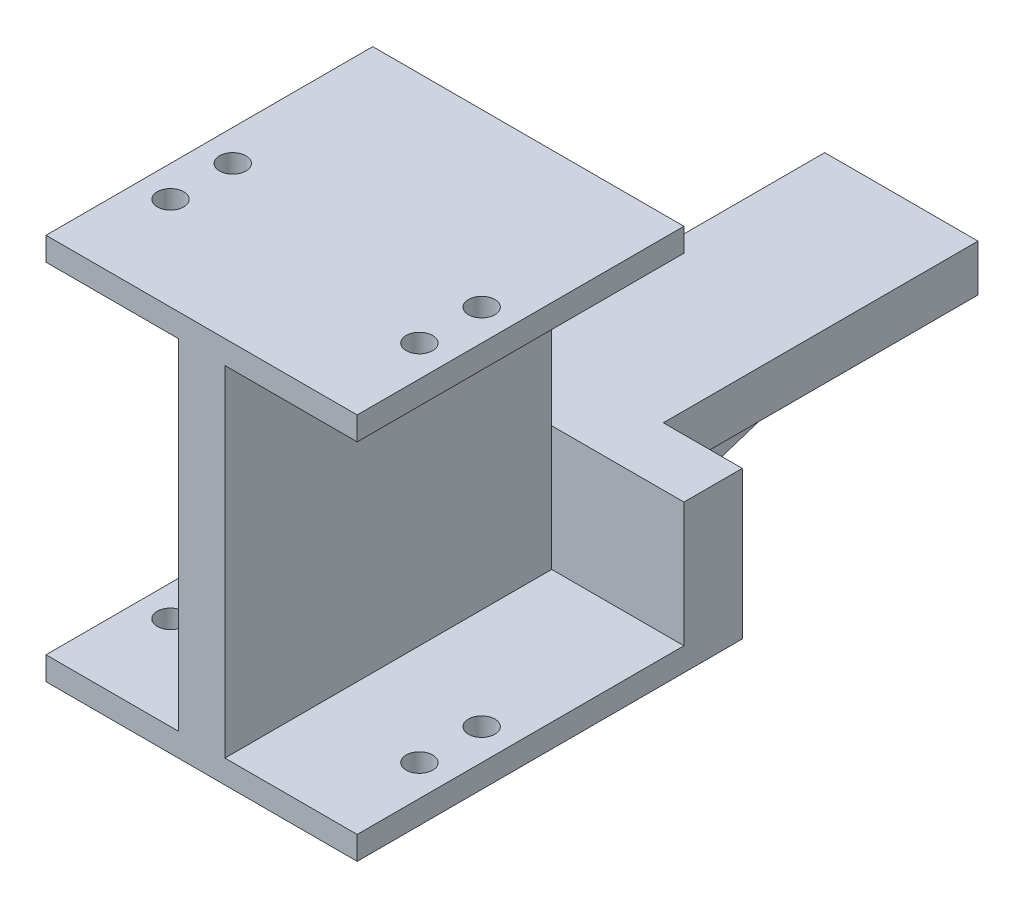
ISO-10303-21;
HEADER;
FILE_DESCRIPTION(('STEP AP214'),'2;1');
FILE_NAME('part.step','',(''),(''),'','','');
FILE_SCHEMA(('AUTOMOTIVE_DESIGN { 1 0 10303 214 1 1 1 1 }'));
ENDSEC;
DATA;
#1=APPLICATION_CONTEXT('core data for automotive mechanical design processes');
#2=APPLICATION_PROTOCOL_DEFINITION('international standard','automotive_design',2000,#1);
#3=PRODUCT_CONTEXT('',#1,'mechanical');
#4=PRODUCT('Part','Part','',(#3));
#5=PRODUCT_RELATED_PRODUCT_CATEGORY('part','',(#4));
#6=PRODUCT_DEFINITION_FORMATION('','',#4);
#7=PRODUCT_DEFINITION_CONTEXT('part definition',#1,'design');
#8=PRODUCT_DEFINITION('design','',#6,#7);
#9=PRODUCT_DEFINITION_SHAPE('','',#8);
#10=(LENGTH_UNIT() NAMED_UNIT(*) SI_UNIT(.MILLI.,.METRE.));
#11=(NAMED_UNIT(*) PLANE_ANGLE_UNIT() SI_UNIT($,.RADIAN.));
#12=(NAMED_UNIT(*) SI_UNIT($,.STERADIAN.) SOLID_ANGLE_UNIT());
#13=UNCERTAINTY_MEASURE_WITH_UNIT(LENGTH_MEASURE(1.E-05),#10,'distance_accuracy_value','');
#14=(GEOMETRIC_REPRESENTATION_CONTEXT(3) GLOBAL_UNCERTAINTY_ASSIGNED_CONTEXT((#13)) GLOBAL_UNIT_ASSIGNED_CONTEXT((#10,
#11,#12)) REPRESENTATION_CONTEXT('',''));
#15=CARTESIAN_POINT('',(0.,0.,0.));
#16=DIRECTION('',(0.,0.,1.));
#17=DIRECTION('',(1.,0.,0.));
#18=AXIS2_PLACEMENT_3D('',#15,#16,#17);
#19=CARTESIAN_POINT('',(20.,34.8470514902493,-7.49999999999995));
#20=DIRECTION('',(0.,0.,-1.));
#21=DIRECTION('',(-1.,0.,0.));
#22=AXIS2_PLACEMENT_3D('',#19,#20,#21);
#23=PLANE('',#22);
#24=DIRECTION('',(-1.,0.,0.));
#25=VECTOR('',#24,1.);
#26=CARTESIAN_POINT('',(9.85,-11.85,-7.49999999999995));
#27=LINE('',#26,#25);
#28=CARTESIAN_POINT('',(-3.,-11.85,-7.49999999999995));
#29=VERTEX_POINT('',#28);
#30=CARTESIAN_POINT('',(-9.85,-11.85,-7.49999999999995));
#31=VERTEX_POINT('',#30);
#32=EDGE_CURVE('E211',#29,#31,#27,.T.);
#33=ORIENTED_EDGE('',*,*,#32,.F.);
#34=DIRECTION('',(0.,-1.,0.));
#35=VECTOR('',#34,1.);
#36=CARTESIAN_POINT('',(-3.,34.8470514902493,-7.49999999999995));
#37=LINE('',#36,#35);
#38=CARTESIAN_POINT('',(-3.,-24.85,-7.49999999999995));
#39=VERTEX_POINT('',#38);
#40=EDGE_CURVE('E199',#29,#39,#37,.T.);
#41=ORIENTED_EDGE('',*,*,#40,.T.);
#42=DIRECTION('',(1.,0.,0.));
#43=VECTOR('',#42,1.);
#44=CARTESIAN_POINT('',(20.,-24.85,-7.49999999999995));
#45=LINE('',#44,#43);
#46=CARTESIAN_POINT('',(-20.,-24.85,-7.49999999999995));
#47=VERTEX_POINT('',#46);
#48=EDGE_CURVE('E209',#47,#39,#45,.T.);
#49=ORIENTED_EDGE('',*,*,#48,.F.);
#50=DIRECTION('',(0.,-1.,0.));
#51=VECTOR('',#50,1.);
#52=CARTESIAN_POINT('',(-20.,34.8470514902493,-7.49999999999995));
#53=LINE('',#52,#51);
#54=CARTESIAN_POINT('',(-20.,-5.85,-7.49999999999995));
#55=VERTEX_POINT('',#54);
#56=EDGE_CURVE('E235',#55,#47,#53,.T.);
#57=ORIENTED_EDGE('',*,*,#56,.F.);
#58=DIRECTION('',(-1.,0.,0.));
#59=VECTOR('',#58,1.);
#60=CARTESIAN_POINT('',(20.,-5.85,-7.49999999999995));
#61=LINE('',#60,#59);
#62=CARTESIAN_POINT('',(-9.85,-5.85,-7.49999999999995));
#63=VERTEX_POINT('',#62);
#64=EDGE_CURVE('E385',#63,#55,#61,.T.);
#65=ORIENTED_EDGE('',*,*,#64,.F.);
#66=DIRECTION('',(0.,1.,0.));
#67=VECTOR('',#66,1.);
#68=CARTESIAN_POINT('',(-9.85,-5.85,-7.49999999999995));
#69=LINE('',#68,#67);
#70=EDGE_CURVE('E361',#31,#63,#69,.T.);
#71=ORIENTED_EDGE('',*,*,#70,.F.);
#72=EDGE_LOOP('',(#33,#41,#49,#57,#65,#71));
#73=FACE_BOUND('',#72,.T.);
#74=ADVANCED_FACE('F33',(#73),#23,.T.);
#75=CARTESIAN_POINT('',(9.85,-11.85,-47.95));
#76=DIRECTION('',(0.,1.,0.));
#77=DIRECTION('',(-1.,0.,0.));
#78=AXIS2_PLACEMENT_3D('',#75,#76,#77);
#79=PLANE('',#78);
#80=DIRECTION('',(0.,0.,-1.));
#81=VECTOR('',#80,1.);
#82=CARTESIAN_POINT('',(-3.,-11.85,-47.95));
#83=LINE('',#82,#81);
#84=CARTESIAN_POINT('',(-3.,-11.85,-47.95));
#85=VERTEX_POINT('',#84);
#86=EDGE_CURVE('E201',#29,#85,#83,.T.);
#87=ORIENTED_EDGE('',*,*,#86,.F.);
#88=ORIENTED_EDGE('',*,*,#32,.T.);
#89=DIRECTION('',(0.,0.,1.));
#90=VECTOR('',#89,1.);
#91=CARTESIAN_POINT('',(-9.85,-11.85,-47.95));
#92=LINE('',#91,#90);
#93=CARTESIAN_POINT('',(-9.85,-11.85,-47.95));
#94=VERTEX_POINT('',#93);
#95=EDGE_CURVE('E381',#94,#31,#92,.T.);
#96=ORIENTED_EDGE('',*,*,#95,.F.);
#97=DIRECTION('',(-1.,0.,0.));
#98=VECTOR('',#97,1.);
#99=CARTESIAN_POINT('',(9.85,-11.85,-47.95));
#100=LINE('',#99,#98);
#101=EDGE_CURVE('E360',#85,#94,#100,.T.);
#102=ORIENTED_EDGE('',*,*,#101,.F.);
#103=EDGE_LOOP('',(#87,#88,#96,#102));
#104=FACE_BOUND('',#103,.T.);
#105=ADVANCED_FACE('F466',(#104),#79,.F.);
#106=CARTESIAN_POINT('',(0.,0.,0.));
#107=DIRECTION('',(0.,0.,1.));
#108=DIRECTION('',(1.,0.,0.));
#109=AXIS2_PLACEMENT_3D('',#106,#107,#108);
#110=PLANE('',#109);
#111=DIRECTION('',(1.,0.,0.));
#112=VECTOR('',#111,1.);
#113=CARTESIAN_POINT('',(3.,21.85,0.));
#114=LINE('',#113,#112);
#115=CARTESIAN_POINT('',(3.,21.85,0.));
#116=VERTEX_POINT('',#115);
#117=CARTESIAN_POINT('',(20.,21.85,0.));
#118=VERTEX_POINT('',#117);
#119=EDGE_CURVE('E240',#116,#118,#114,.T.);
#120=ORIENTED_EDGE('',*,*,#119,.F.);
#121=DIRECTION('',(0.,1.,0.));
#122=VECTOR('',#121,1.);
#123=CARTESIAN_POINT('',(3.,-21.85,0.));
#124=LINE('',#123,#122);
#125=CARTESIAN_POINT('',(3.,-5.85,0.));
#126=VERTEX_POINT('',#125);
#127=EDGE_CURVE('E286',#126,#116,#124,.T.);
#128=ORIENTED_EDGE('',*,*,#127,.F.);
#129=DIRECTION('',(1.,0.,0.));
#130=VECTOR('',#129,1.);
#131=CARTESIAN_POINT('',(20.,-5.85,0.));
#132=LINE('',#131,#130);
#133=CARTESIAN_POINT('',(-3.,-5.85,0.));
#134=VERTEX_POINT('',#133);
#135=EDGE_CURVE('E11',#134,#126,#132,.T.);
#136=ORIENTED_EDGE('',*,*,#135,.F.);
#137=DIRECTION('',(0.,-1.,0.));
#138=VECTOR('',#137,1.);
#139=CARTESIAN_POINT('',(-3.,-21.85,0.));
#140=LINE('',#139,#138);
#141=CARTESIAN_POINT('',(-3.,21.85,0.));
#142=VERTEX_POINT('',#141);
#143=EDGE_CURVE('E279',#142,#134,#140,.T.);
#144=ORIENTED_EDGE('',*,*,#143,.F.);
#145=DIRECTION('',(1.,0.,0.));
#146=VECTOR('',#145,1.);
#147=CARTESIAN_POINT('',(-20.,21.85,0.));
#148=LINE('',#147,#146);
#149=CARTESIAN_POINT('',(-20.,21.85,0.));
#150=VERTEX_POINT('',#149);
#151=EDGE_CURVE('E276',#150,#142,#148,.T.);
#152=ORIENTED_EDGE('',*,*,#151,.F.);
#153=DIRECTION('',(0.,-1.,0.));
#154=VECTOR('',#153,1.);
#155=CARTESIAN_POINT('',(-20.,21.85,0.));
#156=LINE('',#155,#154);
#157=CARTESIAN_POINT('',(-20.,24.85,0.));
#158=VERTEX_POINT('',#157);
#159=EDGE_CURVE('E274',#158,#150,#156,.T.);
#160=ORIENTED_EDGE('',*,*,#159,.F.);
#161=DIRECTION('',(-1.,0.,0.));
#162=VECTOR('',#161,1.);
#163=CARTESIAN_POINT('',(-20.,24.85,0.));
#164=LINE('',#163,#162);
#165=CARTESIAN_POINT('',(20.,24.85,0.));
#166=VERTEX_POINT('',#165);
#167=EDGE_CURVE('E272',#166,#158,#164,.T.);
#168=ORIENTED_EDGE('',*,*,#167,.F.);
#169=DIRECTION('',(0.,1.,0.));
#170=VECTOR('',#169,1.);
#171=CARTESIAN_POINT('',(20.,21.85,0.));
#172=LINE('',#171,#170);
#173=EDGE_CURVE('E270',#118,#166,#172,.T.);
#174=ORIENTED_EDGE('',*,*,#173,.F.);
#175=EDGE_LOOP('',(#120,#128,#136,#144,#152,#160,#168,#174));
#176=FACE_BOUND('',#175,.T.);
#177=ADVANCED_FACE('F411',(#176),#110,.F.);
#178=CARTESIAN_POINT('',(3.,21.85,42.));
#179=DIRECTION('',(0.,1.,0.));
#180=DIRECTION('',(0.,0.,1.));
#181=AXIS2_PLACEMENT_3D('',#178,#179,#180);
#182=PLANE('',#181);
#183=CARTESIAN_POINT('',(16.,21.85,22.));
#184=DIRECTION('',(0.,1.,0.));
#185=DIRECTION('',(0.,0.,1.));
#186=AXIS2_PLACEMENT_3D('',#183,#184,#185);
#187=CIRCLE('',#186,1.7);
#188=CARTESIAN_POINT('',(16.,21.85,23.7));
#189=VERTEX_POINT('',#188);
#190=EDGE_CURVE('E338',#189,#189,#187,.T.);
#191=ORIENTED_EDGE('',*,*,#190,.T.);
#192=EDGE_LOOP('',(#191));
#193=FACE_BOUND('',#192,.T.);
#194=CARTESIAN_POINT('',(16.,21.85,30.));
#195=DIRECTION('',(0.,1.,0.));
#196=DIRECTION('',(0.,0.,1.));
#197=AXIS2_PLACEMENT_3D('',#194,#195,#196);
#198=CIRCLE('',#197,1.7);
#199=CARTESIAN_POINT('',(16.,21.85,31.7));
#200=VERTEX_POINT('',#199);
#201=EDGE_CURVE('E320',#200,#200,#198,.T.);
#202=ORIENTED_EDGE('',*,*,#201,.T.);
#203=EDGE_LOOP('',(#202));
#204=FACE_BOUND('',#203,.T.);
#205=ORIENTED_EDGE('',*,*,#119,.T.);
#206=DIRECTION('',(0.,0.,-1.));
#207=VECTOR('',#206,1.);
#208=CARTESIAN_POINT('',(20.,21.85,42.));
#209=LINE('',#208,#207);
#210=CARTESIAN_POINT('',(20.,21.85,42.));
#211=VERTEX_POINT('',#210);
#212=EDGE_CURVE('E42',#211,#118,#209,.T.);
#213=ORIENTED_EDGE('',*,*,#212,.F.);
#214=DIRECTION('',(1.,0.,0.));
#215=VECTOR('',#214,1.);
#216=CARTESIAN_POINT('',(3.,21.85,42.));
#217=LINE('',#216,#215);
#218=CARTESIAN_POINT('',(3.,21.85,42.));
#219=VERTEX_POINT('',#218);
#220=EDGE_CURVE('E241',#219,#211,#217,.T.);
#221=ORIENTED_EDGE('',*,*,#220,.F.);
#222=DIRECTION('',(0.,0.,-1.));
#223=VECTOR('',#222,1.);
#224=CARTESIAN_POINT('',(3.,21.85,42.));
#225=LINE('',#224,#223);
#226=EDGE_CURVE('E267',#219,#116,#225,.T.);
#227=ORIENTED_EDGE('',*,*,#226,.T.);
#228=EDGE_LOOP('',(#205,#213,#221,#227));
#229=FACE_BOUND('',#228,.T.);
#230=ADVANCED_FACE('F35',(#193,#204,#229),#182,.F.);
#231=CARTESIAN_POINT('',(20.,21.85,42.));
#232=DIRECTION('',(-1.,0.,0.));
#233=DIRECTION('',(0.,0.,1.));
#234=AXIS2_PLACEMENT_3D('',#231,#232,#233);
#235=PLANE('',#234);
#236=ORIENTED_EDGE('',*,*,#173,.T.);
#237=DIRECTION('',(0.,0.,-1.));
#238=VECTOR('',#237,1.);
#239=CARTESIAN_POINT('',(20.,24.85,42.));
#240=LINE('',#239,#238);
#241=CARTESIAN_POINT('',(20.,24.85,42.));
#242=VERTEX_POINT('',#241);
#243=EDGE_CURVE('E314',#242,#166,#240,.T.);
#244=ORIENTED_EDGE('',*,*,#243,.F.);
#245=DIRECTION('',(0.,1.,0.));
#246=VECTOR('',#245,1.);
#247=CARTESIAN_POINT('',(20.,21.85,42.));
#248=LINE('',#247,#246);
#249=EDGE_CURVE('E244',#211,#242,#248,.T.);
#250=ORIENTED_EDGE('',*,*,#249,.F.);
#251=ORIENTED_EDGE('',*,*,#212,.T.);
#252=EDGE_LOOP('',(#236,#244,#250,#251));
#253=FACE_BOUND('',#252,.T.);
#254=ADVANCED_FACE('F433',(#253),#235,.F.);
#255=CARTESIAN_POINT('',(-20.,24.85,42.));
#256=DIRECTION('',(0.,-1.,0.));
#257=DIRECTION('',(0.,0.,-1.));
#258=AXIS2_PLACEMENT_3D('',#255,#256,#257);
#259=PLANE('',#258);
#260=CARTESIAN_POINT('',(-16.,24.85,30.));
#261=DIRECTION('',(0.,-1.,0.));
#262=DIRECTION('',(0.,0.,1.));
#263=AXIS2_PLACEMENT_3D('',#260,#261,#262);
#264=CIRCLE('',#263,1.7);
#265=CARTESIAN_POINT('',(-16.,24.85,31.7));
#266=VERTEX_POINT('',#265);
#267=EDGE_CURVE('E703',#266,#266,#264,.T.);
#268=ORIENTED_EDGE('',*,*,#267,.T.);
#269=EDGE_LOOP('',(#268));
#270=FACE_BOUND('',#269,.T.);
#271=CARTESIAN_POINT('',(-16.,24.85,22.));
#272=DIRECTION('',(0.,-1.,0.));
#273=DIRECTION('',(0.,0.,1.));
#274=AXIS2_PLACEMENT_3D('',#271,#272,#273);
#275=CIRCLE('',#274,1.7);
#276=CARTESIAN_POINT('',(-16.,24.85,23.7));
#277=VERTEX_POINT('',#276);
#278=EDGE_CURVE('E693',#277,#277,#275,.T.);
#279=ORIENTED_EDGE('',*,*,#278,.T.);
#280=EDGE_LOOP('',(#279));
#281=FACE_BOUND('',#280,.T.);
#282=CARTESIAN_POINT('',(16.,24.85,22.));
#283=DIRECTION('',(0.,-1.,0.));
#284=DIRECTION('',(0.,0.,-1.));
#285=AXIS2_PLACEMENT_3D('',#282,#283,#284);
#286=CIRCLE('',#285,1.7);
#287=CARTESIAN_POINT('',(16.,24.85,20.3));
#288=VERTEX_POINT('',#287);
#289=EDGE_CURVE('E332',#288,#288,#286,.T.);
#290=ORIENTED_EDGE('',*,*,#289,.T.);
#291=EDGE_LOOP('',(#290));
#292=FACE_BOUND('',#291,.T.);
#293=CARTESIAN_POINT('',(16.,24.85,30.));
#294=DIRECTION('',(0.,-1.,0.));
#295=DIRECTION('',(0.,0.,-1.));
#296=AXIS2_PLACEMENT_3D('',#293,#294,#295);
#297=CIRCLE('',#296,1.7);
#298=CARTESIAN_POINT('',(16.,24.85,28.3));
#299=VERTEX_POINT('',#298);
#300=EDGE_CURVE('E321',#299,#299,#297,.T.);
#301=ORIENTED_EDGE('',*,*,#300,.T.);
#302=EDGE_LOOP('',(#301));
#303=FACE_BOUND('',#302,.T.);
#304=ORIENTED_EDGE('',*,*,#167,.T.);
#305=DIRECTION('',(0.,0.,-1.));
#306=VECTOR('',#305,1.);
#307=CARTESIAN_POINT('',(-20.,24.85,42.));
#308=LINE('',#307,#306);
#309=CARTESIAN_POINT('',(-20.,24.85,42.));
#310=VERTEX_POINT('',#309);
#311=EDGE_CURVE('E311',#310,#158,#308,.T.);
#312=ORIENTED_EDGE('',*,*,#311,.F.);
#313=DIRECTION('',(-1.,0.,0.));
#314=VECTOR('',#313,1.);
#315=CARTESIAN_POINT('',(-20.,24.85,42.));
#316=LINE('',#315,#314);
#317=EDGE_CURVE('E247',#242,#310,#316,.T.);
#318=ORIENTED_EDGE('',*,*,#317,.F.);
#319=ORIENTED_EDGE('',*,*,#243,.T.);
#320=EDGE_LOOP('',(#304,#312,#318,#319));
#321=FACE_BOUND('',#320,.T.);
#322=ADVANCED_FACE('F430',(#270,#281,#292,#303,#321),#259,.F.);
#323=CARTESIAN_POINT('',(-20.,21.85,42.));
#324=DIRECTION('',(1.,0.,0.));
#325=DIRECTION('',(0.,0.,-1.));
#326=AXIS2_PLACEMENT_3D('',#323,#324,#325);
#327=PLANE('',#326);
#328=ORIENTED_EDGE('',*,*,#159,.T.);
#329=DIRECTION('',(0.,0.,-1.));
#330=VECTOR('',#329,1.);
#331=CARTESIAN_POINT('',(-20.,21.85,42.));
#332=LINE('',#331,#330);
#333=CARTESIAN_POINT('',(-20.,21.85,42.));
#334=VERTEX_POINT('',#333);
#335=EDGE_CURVE('E308',#334,#150,#332,.T.);
#336=ORIENTED_EDGE('',*,*,#335,.F.);
#337=DIRECTION('',(0.,-1.,0.));
#338=VECTOR('',#337,1.);
#339=CARTESIAN_POINT('',(-20.,21.85,42.));
#340=LINE('',#339,#338);
#341=EDGE_CURVE('E249',#310,#334,#340,.T.);
#342=ORIENTED_EDGE('',*,*,#341,.F.);
#343=ORIENTED_EDGE('',*,*,#311,.T.);
#344=EDGE_LOOP('',(#328,#336,#342,#343));
#345=FACE_BOUND('',#344,.T.);
#346=ADVANCED_FACE('F425',(#345),#327,.F.);
#347=CARTESIAN_POINT('',(-20.,21.85,42.));
#348=DIRECTION('',(0.,1.,0.));
#349=DIRECTION('',(0.,0.,1.));
#350=AXIS2_PLACEMENT_3D('',#347,#348,#349);
#351=PLANE('',#350);
#352=CARTESIAN_POINT('',(-16.,21.85,30.));
#353=DIRECTION('',(0.,1.,0.));
#354=DIRECTION('',(0.,0.,1.));
#355=AXIS2_PLACEMENT_3D('',#352,#353,#354);
#356=CIRCLE('',#355,1.7);
#357=CARTESIAN_POINT('',(-16.,21.85,31.7));
#358=VERTEX_POINT('',#357);
#359=EDGE_CURVE('E203',#358,#358,#356,.T.);
#360=ORIENTED_EDGE('',*,*,#359,.T.);
#361=EDGE_LOOP('',(#360));
#362=FACE_BOUND('',#361,.T.);
#363=CARTESIAN_POINT('',(-16.,21.85,22.));
#364=DIRECTION('',(0.,1.,0.));
#365=DIRECTION('',(0.,0.,1.));
#366=AXIS2_PLACEMENT_3D('',#363,#364,#365);
#367=CIRCLE('',#366,1.7);
#368=CARTESIAN_POINT('',(-16.,21.85,23.7));
#369=VERTEX_POINT('',#368);
#370=EDGE_CURVE('E344',#369,#369,#367,.T.);
#371=ORIENTED_EDGE('',*,*,#370,.T.);
#372=EDGE_LOOP('',(#371));
#373=FACE_BOUND('',#372,.T.);
#374=ORIENTED_EDGE('',*,*,#151,.T.);
#375=DIRECTION('',(0.,0.,-1.));
#376=VECTOR('',#375,1.);
#377=CARTESIAN_POINT('',(-3.,21.85,42.));
#378=LINE('',#377,#376);
#379=CARTESIAN_POINT('',(-3.,21.85,42.));
#380=VERTEX_POINT('',#379);
#381=EDGE_CURVE('E305',#380,#142,#378,.T.);
#382=ORIENTED_EDGE('',*,*,#381,.F.);
#383=DIRECTION('',(1.,0.,0.));
#384=VECTOR('',#383,1.);
#385=CARTESIAN_POINT('',(-20.,21.85,42.));
#386=LINE('',#385,#384);
#387=EDGE_CURVE('E251',#334,#380,#386,.T.);
#388=ORIENTED_EDGE('',*,*,#387,.F.);
#389=ORIENTED_EDGE('',*,*,#335,.T.);
#390=EDGE_LOOP('',(#374,#382,#388,#389));
#391=FACE_BOUND('',#390,.T.);
#392=ADVANCED_FACE('F420',(#362,#373,#391),#351,.F.);
#393=CARTESIAN_POINT('',(-3.,-21.85,42.));
#394=DIRECTION('',(1.,0.,0.));
#395=DIRECTION('',(0.,1.,0.));
#396=AXIS2_PLACEMENT_3D('',#393,#394,#395);
#397=PLANE('',#396);
#398=ORIENTED_EDGE('',*,*,#143,.T.);
#399=CARTESIAN_POINT('',(-3.,-21.85,0.));
#400=VERTEX_POINT('',#399);
#401=EDGE_CURVE('E278',#134,#400,#140,.T.);
#402=ORIENTED_EDGE('',*,*,#401,.T.);
#403=DIRECTION('',(0.,0.,-1.));
#404=VECTOR('',#403,1.);
#405=CARTESIAN_POINT('',(-3.,-21.85,42.));
#406=LINE('',#405,#404);
#407=CARTESIAN_POINT('',(-3.,-21.85,42.));
#408=VERTEX_POINT('',#407);
#409=EDGE_CURVE('E302',#408,#400,#406,.T.);
#410=ORIENTED_EDGE('',*,*,#409,.F.);
#411=DIRECTION('',(0.,-1.,0.));
#412=VECTOR('',#411,1.);
#413=CARTESIAN_POINT('',(-3.,-21.85,42.));
#414=LINE('',#413,#412);
#415=EDGE_CURVE('E253',#380,#408,#414,.T.);
#416=ORIENTED_EDGE('',*,*,#415,.F.);
#417=ORIENTED_EDGE('',*,*,#381,.T.);
#418=EDGE_LOOP('',(#398,#402,#410,#416,#417));
#419=FACE_BOUND('',#418,.T.);
#420=ADVANCED_FACE('F414',(#419),#397,.F.);
#421=CARTESIAN_POINT('',(-20.,-21.85,42.));
#422=DIRECTION('',(0.,-1.,0.));
#423=DIRECTION('',(0.,0.,-1.));
#424=AXIS2_PLACEMENT_3D('',#421,#422,#423);
#425=PLANE('',#424);
#426=CARTESIAN_POINT('',(-16.,-21.85,30.));
#427=DIRECTION('',(0.,-1.,0.));
#428=DIRECTION('',(0.,0.,-1.));
#429=AXIS2_PLACEMENT_3D('',#426,#427,#428);
#430=CIRCLE('',#429,1.7);
#431=CARTESIAN_POINT('',(-16.,-21.85,28.3));
#432=VERTEX_POINT('',#431);
#433=EDGE_CURVE('E347',#432,#432,#430,.T.);
#434=ORIENTED_EDGE('',*,*,#433,.T.);
#435=EDGE_LOOP('',(#434));
#436=FACE_BOUND('',#435,.T.);
#437=CARTESIAN_POINT('',(-16.,-21.85,22.));
#438=DIRECTION('',(0.,-1.,0.));
#439=DIRECTION('',(0.,0.,-1.));
#440=AXIS2_PLACEMENT_3D('',#437,#438,#439);
#441=CIRCLE('',#440,1.7);
#442=CARTESIAN_POINT('',(-16.,-21.85,20.3));
#443=VERTEX_POINT('',#442);
#444=EDGE_CURVE('E341',#443,#443,#441,.T.);
#445=ORIENTED_EDGE('',*,*,#444,.T.);
#446=EDGE_LOOP('',(#445));
#447=FACE_BOUND('',#446,.T.);
#448=DIRECTION('',(-1.,0.,0.));
#449=VECTOR('',#448,1.);
#450=CARTESIAN_POINT('',(-20.,-21.85,0.));
#451=LINE('',#450,#449);
#452=CARTESIAN_POINT('',(-20.,-21.85,0.));
#453=VERTEX_POINT('',#452);
#454=EDGE_CURVE('E282',#400,#453,#451,.T.);
#455=ORIENTED_EDGE('',*,*,#454,.T.);
#456=DIRECTION('',(0.,0.,-1.));
#457=VECTOR('',#456,1.);
#458=CARTESIAN_POINT('',(-20.,-21.85,42.));
#459=LINE('',#458,#457);
#460=CARTESIAN_POINT('',(-20.,-21.85,42.));
#461=VERTEX_POINT('',#460);
#462=EDGE_CURVE('E299',#461,#453,#459,.T.);
#463=ORIENTED_EDGE('',*,*,#462,.F.);
#464=DIRECTION('',(-1.,0.,0.));
#465=VECTOR('',#464,1.);
#466=CARTESIAN_POINT('',(-20.,-21.85,42.));
#467=LINE('',#466,#465);
#468=EDGE_CURVE('E255',#408,#461,#467,.T.);
#469=ORIENTED_EDGE('',*,*,#468,.F.);
#470=ORIENTED_EDGE('',*,*,#409,.T.);
#471=EDGE_LOOP('',(#455,#463,#469,#470));
#472=FACE_BOUND('',#471,.T.);
#473=ADVANCED_FACE('F514',(#436,#447,#472),#425,.F.);
#474=CARTESIAN_POINT('',(-20.,-21.85,42.));
#475=DIRECTION('',(1.,0.,0.));
#476=DIRECTION('',(0.,0.,-1.));
#477=AXIS2_PLACEMENT_3D('',#474,#475,#476);
#478=PLANE('',#477);
#479=ORIENTED_EDGE('',*,*,#462,.T.);
#480=DIRECTION('',(0.,-1.,0.));
#481=VECTOR('',#480,1.);
#482=CARTESIAN_POINT('',(-20.,34.8470514902493,0.));
#483=LINE('',#482,#481);
#484=CARTESIAN_POINT('',(-20.,-5.85,0.));
#485=VERTEX_POINT('',#484);
#486=EDGE_CURVE('E224',#485,#453,#483,.T.);
#487=ORIENTED_EDGE('',*,*,#486,.F.);
#488=DIRECTION('',(0.,0.,1.));
#489=VECTOR('',#488,1.);
#490=CARTESIAN_POINT('',(-20.,-5.85,0.));
#491=LINE('',#490,#489);
#492=EDGE_CURVE('E234',#55,#485,#491,.T.);
#493=ORIENTED_EDGE('',*,*,#492,.F.);
#494=ORIENTED_EDGE('',*,*,#56,.T.);
#495=DIRECTION('',(0.,0.,-1.));
#496=VECTOR('',#495,1.);
#497=CARTESIAN_POINT('',(-20.,-24.85,42.));
#498=LINE('',#497,#496);
#499=CARTESIAN_POINT('',(-20.,-24.85,42.));
#500=VERTEX_POINT('',#499);
#501=EDGE_CURVE('E218',#500,#47,#498,.T.);
#502=ORIENTED_EDGE('',*,*,#501,.F.);
#503=DIRECTION('',(0.,-1.,0.));
#504=VECTOR('',#503,1.);
#505=CARTESIAN_POINT('',(-20.,-21.85,42.));
#506=LINE('',#505,#504);
#507=EDGE_CURVE('E257',#461,#500,#506,.T.);
#508=ORIENTED_EDGE('',*,*,#507,.F.);
#509=EDGE_LOOP('',(#479,#487,#493,#494,#502,#508));
#510=FACE_BOUND('',#509,.T.);
#511=ADVANCED_FACE('F397',(#510),#478,.F.);
#512=CARTESIAN_POINT('',(-20.,-24.85,42.));
#513=DIRECTION('',(0.,1.,0.));
#514=DIRECTION('',(0.,0.,1.));
#515=AXIS2_PLACEMENT_3D('',#512,#513,#514);
#516=PLANE('',#515);
#517=CARTESIAN_POINT('',(-16.,-24.85,30.));
#518=DIRECTION('',(0.,-1.,0.));
#519=DIRECTION('',(0.,0.,1.));
#520=AXIS2_PLACEMENT_3D('',#517,#518,#519);
#521=CIRCLE('',#520,1.7);
#522=CARTESIAN_POINT('',(-16.,-24.85,31.7));
#523=VERTEX_POINT('',#522);
#524=EDGE_CURVE('E335',#523,#523,#521,.T.);
#525=ORIENTED_EDGE('',*,*,#524,.F.);
#526=EDGE_LOOP('',(#525));
#527=FACE_BOUND('',#526,.T.);
#528=CARTESIAN_POINT('',(-16.,-24.85,22.));
#529=DIRECTION('',(0.,-1.,0.));
#530=DIRECTION('',(0.,0.,1.));
#531=AXIS2_PLACEMENT_3D('',#528,#529,#530);
#532=CIRCLE('',#531,1.7);
#533=CARTESIAN_POINT('',(-16.,-24.85,23.7));
#534=VERTEX_POINT('',#533);
#535=EDGE_CURVE('E698',#534,#534,#532,.T.);
#536=ORIENTED_EDGE('',*,*,#535,.F.);
#537=EDGE_LOOP('',(#536));
#538=FACE_BOUND('',#537,.T.);
#539=CARTESIAN_POINT('',(16.,-24.85,22.));
#540=DIRECTION('',(0.,-1.,0.));
#541=DIRECTION('',(0.,0.,-1.));
#542=AXIS2_PLACEMENT_3D('',#539,#540,#541);
#543=CIRCLE('',#542,1.7);
#544=CARTESIAN_POINT('',(16.,-24.85,20.3));
#545=VERTEX_POINT('',#544);
#546=EDGE_CURVE('E697',#545,#545,#543,.T.);
#547=ORIENTED_EDGE('',*,*,#546,.F.);
#548=EDGE_LOOP('',(#547));
#549=FACE_BOUND('',#548,.T.);
#550=CARTESIAN_POINT('',(16.,-24.85,30.));
#551=DIRECTION('',(0.,-1.,0.));
#552=DIRECTION('',(0.,0.,-1.));
#553=AXIS2_PLACEMENT_3D('',#550,#551,#552);
#554=CIRCLE('',#553,1.7);
#555=CARTESIAN_POINT('',(16.,-24.85,28.3));
#556=VERTEX_POINT('',#555);
#557=EDGE_CURVE('E327',#556,#556,#554,.T.);
#558=ORIENTED_EDGE('',*,*,#557,.F.);
#559=EDGE_LOOP('',(#558));
#560=FACE_BOUND('',#559,.T.);
#561=DIRECTION('',(0.,0.,-1.));
#562=VECTOR('',#561,1.);
#563=CARTESIAN_POINT('',(20.,-24.85,42.));
#564=LINE('',#563,#562);
#565=CARTESIAN_POINT('',(20.,-24.85,42.));
#566=VERTEX_POINT('',#565);
#567=CARTESIAN_POINT('',(20.,-24.85,-7.49999999999995));
#568=VERTEX_POINT('',#567);
#569=EDGE_CURVE('E295',#566,#568,#564,.T.);
#570=ORIENTED_EDGE('',*,*,#569,.F.);
#571=DIRECTION('',(1.,0.,0.));
#572=VECTOR('',#571,1.);
#573=CARTESIAN_POINT('',(-20.,-24.85,42.));
#574=LINE('',#573,#572);
#575=EDGE_CURVE('E259',#500,#566,#574,.T.);
#576=ORIENTED_EDGE('',*,*,#575,.F.);
#577=ORIENTED_EDGE('',*,*,#501,.T.);
#578=ORIENTED_EDGE('',*,*,#48,.T.);
#579=DIRECTION('',(1.,0.,0.));
#580=VECTOR('',#579,1.);
#581=CARTESIAN_POINT('',(20.,-24.85,-7.49999999999995));
#582=LINE('',#581,#580);
#583=CARTESIAN_POINT('',(3.,-24.85,-7.49999999999995));
#584=VERTEX_POINT('',#583);
#585=EDGE_CURVE('E186',#584,#39,#582,.F.);
#586=ORIENTED_EDGE('',*,*,#585,.F.);
#587=EDGE_CURVE('E221',#584,#568,#45,.T.);
#588=ORIENTED_EDGE('',*,*,#587,.T.);
#589=EDGE_LOOP('',(#570,#576,#577,#578,#586,#588));
#590=FACE_BOUND('',#589,.T.);
#591=ADVANCED_FACE('F215',(#527,#538,#549,#560,#590),#516,.F.);
#592=CARTESIAN_POINT('',(20.,-21.85,42.));
#593=DIRECTION('',(-1.,0.,0.));
#594=DIRECTION('',(0.,0.,1.));
#595=AXIS2_PLACEMENT_3D('',#592,#593,#594);
#596=PLANE('',#595);
#597=ORIENTED_EDGE('',*,*,#569,.T.);
#598=DIRECTION('',(0.,-1.,0.));
#599=VECTOR('',#598,1.);
#600=CARTESIAN_POINT('',(20.,34.8470514902493,-7.49999999999995));
#601=LINE('',#600,#599);
#602=CARTESIAN_POINT('',(20.,-5.85,-7.49999999999995));
#603=VERTEX_POINT('',#602);
#604=EDGE_CURVE('E231',#603,#568,#601,.T.);
#605=ORIENTED_EDGE('',*,*,#604,.F.);
#606=DIRECTION('',(0.,0.,-1.));
#607=VECTOR('',#606,1.);
#608=CARTESIAN_POINT('',(20.,-5.85,0.));
#609=LINE('',#608,#607);
#610=CARTESIAN_POINT('',(20.,-5.85,0.));
#611=VERTEX_POINT('',#610);
#612=EDGE_CURVE('E229',#611,#603,#609,.T.);
#613=ORIENTED_EDGE('',*,*,#612,.F.);
#614=DIRECTION('',(0.,-1.,0.));
#615=VECTOR('',#614,1.);
#616=CARTESIAN_POINT('',(20.,34.8470514902493,0.));
#617=LINE('',#616,#615);
#618=CARTESIAN_POINT('',(20.,-21.85,0.));
#619=VERTEX_POINT('',#618);
#620=EDGE_CURVE('E220',#611,#619,#617,.T.);
#621=ORIENTED_EDGE('',*,*,#620,.T.);
#622=DIRECTION('',(0.,0.,-1.));
#623=VECTOR('',#622,1.);
#624=CARTESIAN_POINT('',(20.,-21.85,42.));
#625=LINE('',#624,#623);
#626=CARTESIAN_POINT('',(20.,-21.85,42.));
#627=VERTEX_POINT('',#626);
#628=EDGE_CURVE('E293',#627,#619,#625,.T.);
#629=ORIENTED_EDGE('',*,*,#628,.F.);
#630=DIRECTION('',(0.,1.,0.));
#631=VECTOR('',#630,1.);
#632=CARTESIAN_POINT('',(20.,-21.85,42.));
#633=LINE('',#632,#631);
#634=EDGE_CURVE('E261',#566,#627,#633,.T.);
#635=ORIENTED_EDGE('',*,*,#634,.F.);
#636=EDGE_LOOP('',(#597,#605,#613,#621,#629,#635));
#637=FACE_BOUND('',#636,.T.);
#638=ADVANCED_FACE('F449',(#637),#596,.F.);
#639=CARTESIAN_POINT('',(3.,-21.85,42.));
#640=DIRECTION('',(0.,-1.,0.));
#641=DIRECTION('',(0.,0.,-1.));
#642=AXIS2_PLACEMENT_3D('',#639,#640,#641);
#643=PLANE('',#642);
#644=CARTESIAN_POINT('',(16.,-21.85,22.));
#645=DIRECTION('',(0.,-1.,0.));
#646=DIRECTION('',(0.,0.,-1.));
#647=AXIS2_PLACEMENT_3D('',#644,#645,#646);
#648=CIRCLE('',#647,1.7);
#649=CARTESIAN_POINT('',(16.,-21.85,20.3));
#650=VERTEX_POINT('',#649);
#651=EDGE_CURVE('E37',#650,#650,#648,.T.);
#652=ORIENTED_EDGE('',*,*,#651,.T.);
#653=EDGE_LOOP('',(#652));
#654=FACE_BOUND('',#653,.T.);
#655=CARTESIAN_POINT('',(16.,-21.85,30.));
#656=DIRECTION('',(0.,-1.,0.));
#657=DIRECTION('',(0.,0.,-1.));
#658=AXIS2_PLACEMENT_3D('',#655,#656,#657);
#659=CIRCLE('',#658,1.7);
#660=CARTESIAN_POINT('',(16.,-21.85,28.3));
#661=VERTEX_POINT('',#660);
#662=EDGE_CURVE('E318',#661,#661,#659,.T.);
#663=ORIENTED_EDGE('',*,*,#662,.T.);
#664=EDGE_LOOP('',(#663));
#665=FACE_BOUND('',#664,.T.);
#666=DIRECTION('',(-1.,0.,0.));
#667=VECTOR('',#666,1.);
#668=CARTESIAN_POINT('',(3.,-21.85,0.));
#669=LINE('',#668,#667);
#670=CARTESIAN_POINT('',(3.,-21.85,0.));
#671=VERTEX_POINT('',#670);
#672=EDGE_CURVE('E284',#619,#671,#669,.T.);
#673=ORIENTED_EDGE('',*,*,#672,.T.);
#674=DIRECTION('',(0.,0.,-1.));
#675=VECTOR('',#674,1.);
#676=CARTESIAN_POINT('',(3.,-21.85,42.));
#677=LINE('',#676,#675);
#678=CARTESIAN_POINT('',(3.,-21.85,42.));
#679=VERTEX_POINT('',#678);
#680=EDGE_CURVE('E290',#679,#671,#677,.T.);
#681=ORIENTED_EDGE('',*,*,#680,.F.);
#682=DIRECTION('',(-1.,0.,0.));
#683=VECTOR('',#682,1.);
#684=CARTESIAN_POINT('',(3.,-21.85,42.));
#685=LINE('',#684,#683);
#686=EDGE_CURVE('E263',#627,#679,#685,.T.);
#687=ORIENTED_EDGE('',*,*,#686,.F.);
#688=ORIENTED_EDGE('',*,*,#628,.T.);
#689=EDGE_LOOP('',(#673,#681,#687,#688));
#690=FACE_BOUND('',#689,.T.);
#691=ADVANCED_FACE('F503',(#654,#665,#690),#643,.F.);
#692=CARTESIAN_POINT('',(3.,-21.85,42.));
#693=DIRECTION('',(-1.,0.,0.));
#694=DIRECTION('',(0.,0.,1.));
#695=AXIS2_PLACEMENT_3D('',#692,#693,#694);
#696=PLANE('',#695);
#697=EDGE_CURVE('E245',#671,#126,#124,.T.);
#698=ORIENTED_EDGE('',*,*,#697,.T.);
#699=ORIENTED_EDGE('',*,*,#127,.T.);
#700=ORIENTED_EDGE('',*,*,#226,.F.);
#701=DIRECTION('',(0.,1.,0.));
#702=VECTOR('',#701,1.);
#703=CARTESIAN_POINT('',(3.,-21.85,42.));
#704=LINE('',#703,#702);
#705=EDGE_CURVE('E265',#679,#219,#704,.T.);
#706=ORIENTED_EDGE('',*,*,#705,.F.);
#707=ORIENTED_EDGE('',*,*,#680,.T.);
#708=EDGE_LOOP('',(#698,#699,#700,#706,#707));
#709=FACE_BOUND('',#708,.T.);
#710=ADVANCED_FACE('F440',(#709),#696,.F.);
#711=CARTESIAN_POINT('',(0.,0.,42.));
#712=DIRECTION('',(0.,0.,1.));
#713=DIRECTION('',(1.,0.,0.));
#714=AXIS2_PLACEMENT_3D('',#711,#712,#713);
#715=PLANE('',#714);
#716=ORIENTED_EDGE('',*,*,#317,.T.);
#717=ORIENTED_EDGE('',*,*,#341,.T.);
#718=ORIENTED_EDGE('',*,*,#387,.T.);
#719=ORIENTED_EDGE('',*,*,#415,.T.);
#720=ORIENTED_EDGE('',*,*,#468,.T.);
#721=ORIENTED_EDGE('',*,*,#507,.T.);
#722=ORIENTED_EDGE('',*,*,#575,.T.);
#723=ORIENTED_EDGE('',*,*,#634,.T.);
#724=ORIENTED_EDGE('',*,*,#686,.T.);
#725=ORIENTED_EDGE('',*,*,#705,.T.);
#726=ORIENTED_EDGE('',*,*,#220,.T.);
#727=ORIENTED_EDGE('',*,*,#249,.T.);
#728=EDGE_LOOP('',(#716,#717,#718,#719,#720,#721,#722,#723,#724,#725,#726,#727));
#729=FACE_BOUND('',#728,.T.);
#730=ADVANCED_FACE('F494',(#729),#715,.T.);
#731=CARTESIAN_POINT('',(20.,34.8470514902493,0.));
#732=DIRECTION('',(0.,0.,1.));
#733=DIRECTION('',(1.,0.,0.));
#734=AXIS2_PLACEMENT_3D('',#731,#732,#733);
#735=PLANE('',#734);
#736=ORIENTED_EDGE('',*,*,#697,.F.);
#737=ORIENTED_EDGE('',*,*,#672,.F.);
#738=ORIENTED_EDGE('',*,*,#620,.F.);
#739=EDGE_CURVE('E45',#126,#611,#132,.T.);
#740=ORIENTED_EDGE('',*,*,#739,.F.);
#741=EDGE_LOOP('',(#736,#737,#738,#740));
#742=FACE_BOUND('',#741,.T.);
#743=ADVANCED_FACE('F445',(#742),#735,.T.);
#744=ORIENTED_EDGE('',*,*,#454,.F.);
#745=ORIENTED_EDGE('',*,*,#401,.F.);
#746=EDGE_CURVE('E44',#485,#134,#132,.T.);
#747=ORIENTED_EDGE('',*,*,#746,.F.);
#748=ORIENTED_EDGE('',*,*,#486,.T.);
#749=EDGE_LOOP('',(#744,#745,#747,#748));
#750=FACE_BOUND('',#749,.T.);
#751=ADVANCED_FACE('F404',(#750),#735,.T.);
#752=DIRECTION('',(0.,-1.,0.));
#753=VECTOR('',#752,1.);
#754=CARTESIAN_POINT('',(3.,34.8470514902493,-7.49999999999995));
#755=LINE('',#754,#753);
#756=CARTESIAN_POINT('',(3.,-11.85,-7.49999999999995));
#757=VERTEX_POINT('',#756);
#758=EDGE_CURVE('E194',#757,#584,#755,.T.);
#759=ORIENTED_EDGE('',*,*,#758,.F.);
#760=CARTESIAN_POINT('',(9.85,-11.85,-7.49999999999995));
#761=VERTEX_POINT('',#760);
#762=EDGE_CURVE('E60',#761,#757,#27,.T.);
#763=ORIENTED_EDGE('',*,*,#762,.F.);
#764=DIRECTION('',(0.,-1.,0.));
#765=VECTOR('',#764,1.);
#766=CARTESIAN_POINT('',(9.85,-5.85,-7.49999999999995));
#767=LINE('',#766,#765);
#768=CARTESIAN_POINT('',(9.85,-5.85,-7.49999999999995));
#769=VERTEX_POINT('',#768);
#770=EDGE_CURVE('E193',#769,#761,#767,.T.);
#771=ORIENTED_EDGE('',*,*,#770,.F.);
#772=EDGE_CURVE('E386',#603,#769,#61,.T.);
#773=ORIENTED_EDGE('',*,*,#772,.F.);
#774=ORIENTED_EDGE('',*,*,#604,.T.);
#775=ORIENTED_EDGE('',*,*,#587,.F.);
#776=EDGE_LOOP('',(#759,#763,#771,#773,#774,#775));
#777=FACE_BOUND('',#776,.T.);
#778=ADVANCED_FACE('F453',(#777),#23,.T.);
#779=CARTESIAN_POINT('',(-9.15,-5.85,-8.74999999999997));
#780=DIRECTION('',(0.,-1.,0.));
#781=DIRECTION('',(-1.,0.,0.));
#782=AXIS2_PLACEMENT_3D('',#779,#780,#781);
#783=PLANE('',#782);
#784=DIRECTION('',(0.,0.,1.));
#785=VECTOR('',#784,1.);
#786=CARTESIAN_POINT('',(9.85,-5.85,-47.95));
#787=LINE('',#786,#785);
#788=CARTESIAN_POINT('',(9.85,-5.85,-47.95));
#789=VERTEX_POINT('',#788);
#790=EDGE_CURVE('E370',#789,#769,#787,.T.);
#791=ORIENTED_EDGE('',*,*,#790,.F.);
#792=DIRECTION('',(1.,0.,0.));
#793=VECTOR('',#792,1.);
#794=CARTESIAN_POINT('',(9.85,-5.85,-47.95));
#795=LINE('',#794,#793);
#796=CARTESIAN_POINT('',(-9.85,-5.85,-47.95));
#797=VERTEX_POINT('',#796);
#798=EDGE_CURVE('E368',#797,#789,#795,.T.);
#799=ORIENTED_EDGE('',*,*,#798,.F.);
#800=DIRECTION('',(0.,0.,1.));
#801=VECTOR('',#800,1.);
#802=CARTESIAN_POINT('',(-9.85,-5.85,-47.95));
#803=LINE('',#802,#801);
#804=EDGE_CURVE('E378',#797,#63,#803,.T.);
#805=ORIENTED_EDGE('',*,*,#804,.T.);
#806=ORIENTED_EDGE('',*,*,#64,.T.);
#807=ORIENTED_EDGE('',*,*,#492,.T.);
#808=ORIENTED_EDGE('',*,*,#746,.T.);
#809=ORIENTED_EDGE('',*,*,#135,.T.);
#810=ORIENTED_EDGE('',*,*,#739,.T.);
#811=ORIENTED_EDGE('',*,*,#612,.T.);
#812=ORIENTED_EDGE('',*,*,#772,.T.);
#813=EDGE_LOOP('',(#791,#799,#805,#806,#807,#808,#809,#810,#811,#812));
#814=FACE_BOUND('',#813,.T.);
#815=ADVANCED_FACE('F392',(#814),#783,.F.);
#816=CARTESIAN_POINT('',(9.85,-5.85,-47.95));
#817=DIRECTION('',(-1.,0.,0.));
#818=DIRECTION('',(0.,0.,1.));
#819=AXIS2_PLACEMENT_3D('',#816,#817,#818);
#820=PLANE('',#819);
#821=ORIENTED_EDGE('',*,*,#770,.T.);
#822=DIRECTION('',(0.,0.,1.));
#823=VECTOR('',#822,1.);
#824=CARTESIAN_POINT('',(9.85,-11.85,-47.95));
#825=LINE('',#824,#823);
#826=CARTESIAN_POINT('',(9.85,-11.85,-47.95));
#827=VERTEX_POINT('',#826);
#828=EDGE_CURVE('E226',#827,#761,#825,.T.);
#829=ORIENTED_EDGE('',*,*,#828,.F.);
#830=DIRECTION('',(0.,-1.,0.));
#831=VECTOR('',#830,1.);
#832=CARTESIAN_POINT('',(9.85,-5.85,-47.95));
#833=LINE('',#832,#831);
#834=EDGE_CURVE('E357',#789,#827,#833,.T.);
#835=ORIENTED_EDGE('',*,*,#834,.F.);
#836=ORIENTED_EDGE('',*,*,#790,.T.);
#837=EDGE_LOOP('',(#821,#829,#835,#836));
#838=FACE_BOUND('',#837,.T.);
#839=ADVANCED_FACE('F456',(#838),#820,.F.);
#840=ORIENTED_EDGE('',*,*,#762,.T.);
#841=DIRECTION('',(0.,0.,-1.));
#842=VECTOR('',#841,1.);
#843=CARTESIAN_POINT('',(3.,-11.85,-47.95));
#844=LINE('',#843,#842);
#845=CARTESIAN_POINT('',(3.,-11.85,-47.95));
#846=VERTEX_POINT('',#845);
#847=EDGE_CURVE('E212',#757,#846,#844,.T.);
#848=ORIENTED_EDGE('',*,*,#847,.T.);
#849=EDGE_CURVE('E362',#827,#846,#100,.T.);
#850=ORIENTED_EDGE('',*,*,#849,.F.);
#851=ORIENTED_EDGE('',*,*,#828,.T.);
#852=EDGE_LOOP('',(#840,#848,#850,#851));
#853=FACE_BOUND('',#852,.T.);
#854=ADVANCED_FACE('F470',(#853),#79,.F.);
#855=CARTESIAN_POINT('',(-9.85,-5.85,-47.95));
#856=DIRECTION('',(1.,0.,0.));
#857=DIRECTION('',(0.,1.,0.));
#858=AXIS2_PLACEMENT_3D('',#855,#856,#857);
#859=PLANE('',#858);
#860=ORIENTED_EDGE('',*,*,#70,.T.);
#861=ORIENTED_EDGE('',*,*,#804,.F.);
#862=DIRECTION('',(0.,1.,0.));
#863=VECTOR('',#862,1.);
#864=CARTESIAN_POINT('',(-9.85,-5.85,-47.95));
#865=LINE('',#864,#863);
#866=EDGE_CURVE('E365',#94,#797,#865,.T.);
#867=ORIENTED_EDGE('',*,*,#866,.F.);
#868=ORIENTED_EDGE('',*,*,#95,.T.);
#869=EDGE_LOOP('',(#860,#861,#867,#868));
#870=FACE_BOUND('',#869,.T.);
#871=ADVANCED_FACE('F464',(#870),#859,.F.);
#872=CARTESIAN_POINT('',(0.,0.,-47.95));
#873=DIRECTION('',(0.,0.,-1.));
#874=DIRECTION('',(-1.,0.,0.));
#875=AXIS2_PLACEMENT_3D('',#872,#873,#874);
#876=PLANE('',#875);
#877=ORIENTED_EDGE('',*,*,#849,.T.);
#878=EDGE_CURVE('E366',#846,#85,#100,.T.);
#879=ORIENTED_EDGE('',*,*,#878,.T.);
#880=ORIENTED_EDGE('',*,*,#101,.T.);
#881=ORIENTED_EDGE('',*,*,#866,.T.);
#882=ORIENTED_EDGE('',*,*,#798,.T.);
#883=ORIENTED_EDGE('',*,*,#834,.T.);
#884=EDGE_LOOP('',(#877,#879,#880,#881,#882,#883));
#885=FACE_BOUND('',#884,.T.);
#886=ADVANCED_FACE('F459',(#885),#876,.T.);
#887=CARTESIAN_POINT('',(0.,-11.85,-47.95));
#888=DIRECTION('',(0.,0.952040804808532,0.305971086835869));
#889=DIRECTION('',(0.,-0.305971086835869,0.952040804808532));
#890=AXIS2_PLACEMENT_3D('',#887,#888,#889);
#891=PLANE('',#890);
#892=DIRECTION('',(0.,-0.305971086835869,0.952040804808532));
#893=VECTOR('',#892,1.);
#894=CARTESIAN_POINT('',(3.,-11.85,-47.95));
#895=LINE('',#894,#893);
#896=EDGE_CURVE('E189',#846,#584,#895,.T.);
#897=ORIENTED_EDGE('',*,*,#896,.T.);
#898=ORIENTED_EDGE('',*,*,#585,.T.);
#899=DIRECTION('',(0.,-0.305971086835869,0.952040804808532));
#900=VECTOR('',#899,1.);
#901=CARTESIAN_POINT('',(-3.,-11.85,-47.95));
#902=LINE('',#901,#900);
#903=EDGE_CURVE('E52',#85,#39,#902,.T.);
#904=ORIENTED_EDGE('',*,*,#903,.F.);
#905=ORIENTED_EDGE('',*,*,#878,.F.);
#906=EDGE_LOOP('',(#897,#898,#904,#905));
#907=FACE_BOUND('',#906,.T.);
#908=ADVANCED_FACE('F187',(#907),#891,.F.);
#909=CARTESIAN_POINT('',(3.,0.,-2.97499999999998));
#910=DIRECTION('',(1.,0.,0.));
#911=DIRECTION('',(0.,0.,-1.));
#912=AXIS2_PLACEMENT_3D('',#909,#910,#911);
#913=PLANE('',#912);
#914=ORIENTED_EDGE('',*,*,#847,.F.);
#915=ORIENTED_EDGE('',*,*,#758,.T.);
#916=ORIENTED_EDGE('',*,*,#896,.F.);
#917=EDGE_LOOP('',(#914,#915,#916));
#918=FACE_BOUND('',#917,.T.);
#919=ADVANCED_FACE('F468',(#918),#913,.T.);
#920=CARTESIAN_POINT('',(-3.,0.,-2.97499999999998));
#921=DIRECTION('',(1.,0.,0.));
#922=DIRECTION('',(0.,0.,-1.));
#923=AXIS2_PLACEMENT_3D('',#920,#921,#922);
#924=PLANE('',#923);
#925=ORIENTED_EDGE('',*,*,#40,.F.);
#926=ORIENTED_EDGE('',*,*,#86,.T.);
#927=ORIENTED_EDGE('',*,*,#903,.T.);
#928=EDGE_LOOP('',(#925,#926,#927));
#929=FACE_BOUND('',#928,.T.);
#930=ADVANCED_FACE('F198',(#929),#924,.F.);
#931=CARTESIAN_POINT('',(16.,24.85,30.));
#932=DIRECTION('',(0.,-1.,0.));
#933=DIRECTION('',(0.,0.,-1.));
#934=AXIS2_PLACEMENT_3D('',#931,#932,#933);
#935=CYLINDRICAL_SURFACE('',#934,1.7);
#936=ORIENTED_EDGE('',*,*,#557,.T.);
#937=EDGE_LOOP('',(#936));
#938=FACE_BOUND('',#937,.T.);
#939=ORIENTED_EDGE('',*,*,#662,.F.);
#940=EDGE_LOOP('',(#939));
#941=FACE_BOUND('',#940,.T.);
#942=ADVANCED_FACE('F544',(#938,#941),#935,.F.);
#943=CARTESIAN_POINT('',(16.,24.85,22.));
#944=DIRECTION('',(0.,-1.,0.));
#945=DIRECTION('',(0.,0.,-1.));
#946=AXIS2_PLACEMENT_3D('',#943,#944,#945);
#947=CYLINDRICAL_SURFACE('',#946,1.7);
#948=ORIENTED_EDGE('',*,*,#546,.T.);
#949=EDGE_LOOP('',(#948));
#950=FACE_BOUND('',#949,.T.);
#951=ORIENTED_EDGE('',*,*,#651,.F.);
#952=EDGE_LOOP('',(#951));
#953=FACE_BOUND('',#952,.T.);
#954=ADVANCED_FACE('F551',(#950,#953),#947,.F.);
#955=CARTESIAN_POINT('',(-16.,24.85,22.));
#956=DIRECTION('',(0.,-1.,0.));
#957=DIRECTION('',(0.,0.,-1.));
#958=AXIS2_PLACEMENT_3D('',#955,#956,#957);
#959=CYLINDRICAL_SURFACE('',#958,1.7);
#960=ORIENTED_EDGE('',*,*,#535,.T.);
#961=EDGE_LOOP('',(#960));
#962=FACE_BOUND('',#961,.T.);
#963=ORIENTED_EDGE('',*,*,#444,.F.);
#964=EDGE_LOOP('',(#963));
#965=FACE_BOUND('',#964,.T.);
#966=ADVANCED_FACE('F563',(#962,#965),#959,.F.);
#967=CARTESIAN_POINT('',(-16.,24.85,30.));
#968=DIRECTION('',(0.,-1.,0.));
#969=DIRECTION('',(0.,0.,-1.));
#970=AXIS2_PLACEMENT_3D('',#967,#968,#969);
#971=CYLINDRICAL_SURFACE('',#970,1.7);
#972=ORIENTED_EDGE('',*,*,#524,.T.);
#973=EDGE_LOOP('',(#972));
#974=FACE_BOUND('',#973,.T.);
#975=ORIENTED_EDGE('',*,*,#433,.F.);
#976=EDGE_LOOP('',(#975));
#977=FACE_BOUND('',#976,.T.);
#978=ADVANCED_FACE('F555',(#974,#977),#971,.F.);
#979=ORIENTED_EDGE('',*,*,#278,.F.);
#980=EDGE_LOOP('',(#979));
#981=FACE_BOUND('',#980,.T.);
#982=ORIENTED_EDGE('',*,*,#370,.F.);
#983=EDGE_LOOP('',(#982));
#984=FACE_BOUND('',#983,.T.);
#985=ADVANCED_FACE('F552',(#981,#984),#959,.F.);
#986=ORIENTED_EDGE('',*,*,#267,.F.);
#987=EDGE_LOOP('',(#986));
#988=FACE_BOUND('',#987,.T.);
#989=ORIENTED_EDGE('',*,*,#359,.F.);
#990=EDGE_LOOP('',(#989));
#991=FACE_BOUND('',#990,.T.);
#992=ADVANCED_FACE('F541',(#988,#991),#971,.F.);
#993=ORIENTED_EDGE('',*,*,#300,.F.);
#994=EDGE_LOOP('',(#993));
#995=FACE_BOUND('',#994,.T.);
#996=ORIENTED_EDGE('',*,*,#201,.F.);
#997=EDGE_LOOP('',(#996));
#998=FACE_BOUND('',#997,.T.);
#999=ADVANCED_FACE('F538',(#995,#998),#935,.F.);
#1000=ORIENTED_EDGE('',*,*,#289,.F.);
#1001=EDGE_LOOP('',(#1000));
#1002=FACE_BOUND('',#1001,.T.);
#1003=ORIENTED_EDGE('',*,*,#190,.F.);
#1004=EDGE_LOOP('',(#1003));
#1005=FACE_BOUND('',#1004,.T.);
#1006=ADVANCED_FACE('F540',(#1002,#1005),#947,.F.);
#1007=CLOSED_SHELL('',(#74,#105,#177,#230,#254,#322,#346,#392,#420,#473,#511,#591,#638,#691,
#710,#730,#743,#751,#778,#815,#839,#854,#871,#886,#908,#919,#930,#942,#954,#966,#978,#985,#992,
#999,#1006));
#1008=MANIFOLD_SOLID_BREP('B2',#1007);
#1009=ADVANCED_BREP_SHAPE_REPRESENTATION('',(#18,#1008),#14);
#1010=SHAPE_DEFINITION_REPRESENTATION(#9,#1009);
ENDSEC;
END-ISO-10303-21;
